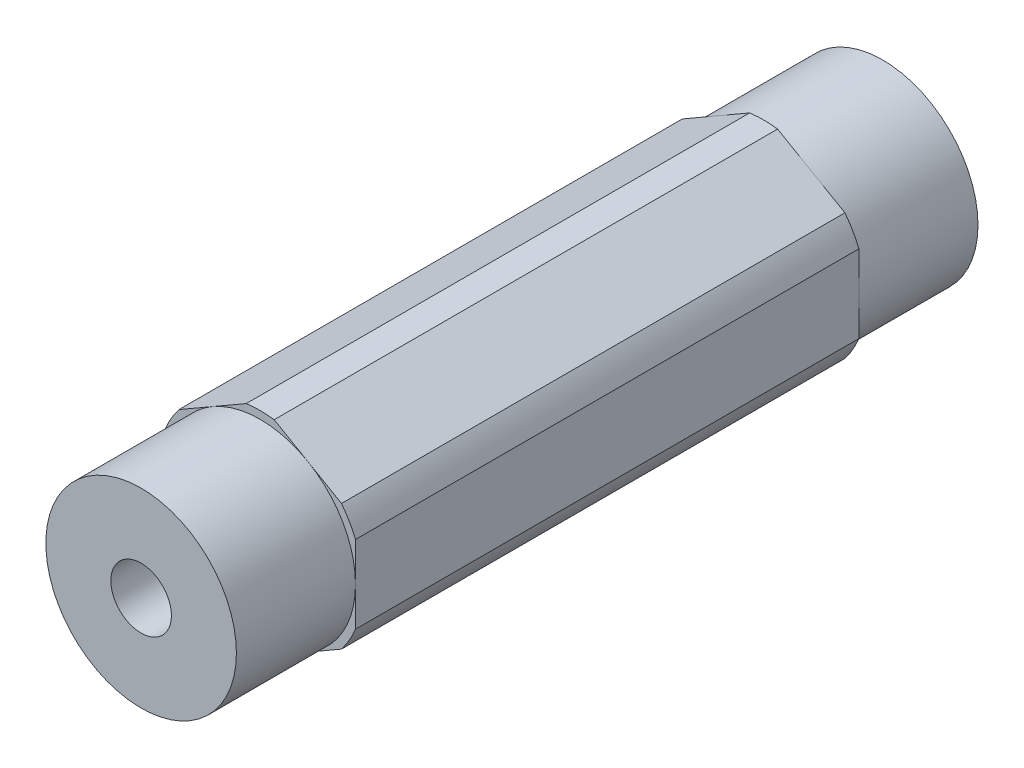
ISO-10303-21;
HEADER;
FILE_DESCRIPTION(('STEP AP214'),'2;1');
FILE_NAME('part.step','',(''),(''),'','','');
FILE_SCHEMA(('AUTOMOTIVE_DESIGN { 1 0 10303 214 1 1 1 1 }'));
ENDSEC;
DATA;
#1=APPLICATION_CONTEXT('core data for automotive mechanical design processes');
#2=APPLICATION_PROTOCOL_DEFINITION('international standard','automotive_design',2000,#1);
#3=PRODUCT_CONTEXT('',#1,'mechanical');
#4=PRODUCT('Part','Part','',(#3));
#5=PRODUCT_RELATED_PRODUCT_CATEGORY('part','',(#4));
#6=PRODUCT_DEFINITION_FORMATION('','',#4);
#7=PRODUCT_DEFINITION_CONTEXT('part definition',#1,'design');
#8=PRODUCT_DEFINITION('design','',#6,#7);
#9=PRODUCT_DEFINITION_SHAPE('','',#8);
#10=(LENGTH_UNIT() NAMED_UNIT(*) SI_UNIT(.MILLI.,.METRE.));
#11=(NAMED_UNIT(*) PLANE_ANGLE_UNIT() SI_UNIT($,.RADIAN.));
#12=(NAMED_UNIT(*) SI_UNIT($,.STERADIAN.) SOLID_ANGLE_UNIT());
#13=UNCERTAINTY_MEASURE_WITH_UNIT(LENGTH_MEASURE(1.E-05),#10,'distance_accuracy_value','');
#14=(GEOMETRIC_REPRESENTATION_CONTEXT(3) GLOBAL_UNCERTAINTY_ASSIGNED_CONTEXT((#13)) GLOBAL_UNIT_ASSIGNED_CONTEXT((#10,
#11,#12)) REPRESENTATION_CONTEXT('',''));
#15=CARTESIAN_POINT('',(0.,0.,0.));
#16=DIRECTION('',(0.,0.,1.));
#17=DIRECTION('',(1.,0.,0.));
#18=AXIS2_PLACEMENT_3D('',#15,#16,#17);
#19=CARTESIAN_POINT('',(0.,0.,-16.77543));
#20=DIRECTION('',(0.,0.,1.));
#21=DIRECTION('',(1.,0.,0.));
#22=AXIS2_PLACEMENT_3D('',#19,#20,#21);
#23=PLANE('',#22);
#24=DIRECTION('',(0.,1.,0.));
#25=VECTOR('',#24,1.);
#26=CARTESIAN_POINT('',(6.35,0.,-16.77543));
#27=LINE('',#26,#25);
#28=CARTESIAN_POINT('',(6.35,0.,-16.77543));
#29=VERTEX_POINT('',#28);
#30=CARTESIAN_POINT('',(6.35,2.59030191290513,-16.77543));
#31=VERTEX_POINT('',#30);
#32=EDGE_CURVE('E226',#29,#31,#27,.T.);
#33=ORIENTED_EDGE('',*,*,#32,.F.);
#34=CARTESIAN_POINT('',(0.,0.,-16.77543));
#35=DIRECTION('',(0.,0.,1.));
#36=DIRECTION('',(1.,0.,0.));
#37=AXIS2_PLACEMENT_3D('',#34,#35,#36);
#38=CIRCLE('',#37,6.35);
#39=CARTESIAN_POINT('',(3.175,5.49926131403119,-16.77543));
#40=VERTEX_POINT('',#39);
#41=EDGE_CURVE('E70',#29,#40,#38,.T.);
#42=ORIENTED_EDGE('',*,*,#41,.T.);
#43=DIRECTION('',(-0.866025403784439,0.5,0.));
#44=VECTOR('',#43,1.);
#45=CARTESIAN_POINT('',(3.175,5.49926131403119,-16.77543));
#46=LINE('',#45,#44);
#47=CARTESIAN_POINT('',(5.41826726004727,4.20411035757862,-16.77543));
#48=VERTEX_POINT('',#47);
#49=EDGE_CURVE('E278',#48,#40,#46,.T.);
#50=ORIENTED_EDGE('',*,*,#49,.F.);
#51=CARTESIAN_POINT('',(0.,0.,-16.77543));
#52=DIRECTION('',(0.,0.,1.));
#53=DIRECTION('',(1.,0.,0.));
#54=AXIS2_PLACEMENT_3D('',#51,#52,#53);
#55=CIRCLE('',#54,6.858);
#56=EDGE_CURVE('E272',#31,#48,#55,.T.);
#57=ORIENTED_EDGE('',*,*,#56,.F.);
#58=EDGE_LOOP('',(#33,#42,#50,#57));
#59=FACE_BOUND('',#58,.T.);
#60=ADVANCED_FACE('F58',(#59),#23,.F.);
#61=CARTESIAN_POINT('',(0.931732739952733,6.79441227048375,-16.77543));
#62=VERTEX_POINT('',#61);
#63=EDGE_CURVE('E275',#40,#62,#46,.T.);
#64=ORIENTED_EDGE('',*,*,#63,.F.);
#65=CARTESIAN_POINT('',(-3.175,5.49926131403119,-16.77543));
#66=VERTEX_POINT('',#65);
#67=EDGE_CURVE('E11',#40,#66,#38,.T.);
#68=ORIENTED_EDGE('',*,*,#67,.T.);
#69=DIRECTION('',(-0.866025403784439,-0.5,0.));
#70=VECTOR('',#69,1.);
#71=CARTESIAN_POINT('',(-3.175,5.49926131403119,-16.77543));
#72=LINE('',#71,#70);
#73=CARTESIAN_POINT('',(-0.931732739952731,6.79441227048375,-16.77543));
#74=VERTEX_POINT('',#73);
#75=EDGE_CURVE('E282',#74,#66,#72,.T.);
#76=ORIENTED_EDGE('',*,*,#75,.F.);
#77=EDGE_CURVE('E277',#62,#74,#55,.T.);
#78=ORIENTED_EDGE('',*,*,#77,.F.);
#79=EDGE_LOOP('',(#64,#68,#76,#78));
#80=FACE_BOUND('',#79,.T.);
#81=ADVANCED_FACE('F444',(#80),#23,.F.);
#82=CARTESIAN_POINT('',(-5.41826726004727,4.20411035757862,-16.77543));
#83=VERTEX_POINT('',#82);
#84=EDGE_CURVE('E287',#66,#83,#72,.T.);
#85=ORIENTED_EDGE('',*,*,#84,.F.);
#86=CARTESIAN_POINT('',(-6.35,0.,-16.77543));
#87=VERTEX_POINT('',#86);
#88=EDGE_CURVE('E68',#66,#87,#38,.T.);
#89=ORIENTED_EDGE('',*,*,#88,.T.);
#90=DIRECTION('',(0.,-1.,0.));
#91=VECTOR('',#90,1.);
#92=CARTESIAN_POINT('',(-6.35,0.,-16.77543));
#93=LINE('',#92,#91);
#94=CARTESIAN_POINT('',(-6.35,2.59030191290514,-16.77543));
#95=VERTEX_POINT('',#94);
#96=EDGE_CURVE('E288',#95,#87,#93,.T.);
#97=ORIENTED_EDGE('',*,*,#96,.F.);
#98=EDGE_CURVE('E286',#83,#95,#55,.T.);
#99=ORIENTED_EDGE('',*,*,#98,.F.);
#100=EDGE_LOOP('',(#85,#89,#97,#99));
#101=FACE_BOUND('',#100,.T.);
#102=ADVANCED_FACE('F391',(#101),#23,.F.);
#103=CARTESIAN_POINT('',(-6.35,-2.59030191290514,-16.77543));
#104=VERTEX_POINT('',#103);
#105=EDGE_CURVE('E293',#87,#104,#93,.T.);
#106=ORIENTED_EDGE('',*,*,#105,.F.);
#107=CARTESIAN_POINT('',(-3.175,-5.49926131403119,-16.77543));
#108=VERTEX_POINT('',#107);
#109=EDGE_CURVE('E377',#87,#108,#38,.T.);
#110=ORIENTED_EDGE('',*,*,#109,.T.);
#111=DIRECTION('',(0.866025403784439,-0.5,0.));
#112=VECTOR('',#111,1.);
#113=CARTESIAN_POINT('',(-3.175,-5.49926131403118,-16.77543));
#114=LINE('',#113,#112);
#115=CARTESIAN_POINT('',(-5.41826726004728,-4.20411035757862,-16.77543));
#116=VERTEX_POINT('',#115);
#117=EDGE_CURVE('E294',#116,#108,#114,.T.);
#118=ORIENTED_EDGE('',*,*,#117,.F.);
#119=EDGE_CURVE('E292',#104,#116,#55,.T.);
#120=ORIENTED_EDGE('',*,*,#119,.F.);
#121=EDGE_LOOP('',(#106,#110,#118,#120));
#122=FACE_BOUND('',#121,.T.);
#123=ADVANCED_FACE('F394',(#122),#23,.F.);
#124=CARTESIAN_POINT('',(-0.931732739952721,-6.79441227048375,-16.77543));
#125=VERTEX_POINT('',#124);
#126=EDGE_CURVE('E299',#108,#125,#114,.T.);
#127=ORIENTED_EDGE('',*,*,#126,.F.);
#128=CARTESIAN_POINT('',(3.175,-5.49926131403119,-16.77543));
#129=VERTEX_POINT('',#128);
#130=EDGE_CURVE('E370',#108,#129,#38,.T.);
#131=ORIENTED_EDGE('',*,*,#130,.T.);
#132=DIRECTION('',(0.866025403784439,0.5,0.));
#133=VECTOR('',#132,1.);
#134=CARTESIAN_POINT('',(3.175,-5.49926131403118,-16.77543));
#135=LINE('',#134,#133);
#136=CARTESIAN_POINT('',(0.931732739952731,-6.79441227048375,-16.77543));
#137=VERTEX_POINT('',#136);
#138=EDGE_CURVE('E300',#137,#129,#135,.T.);
#139=ORIENTED_EDGE('',*,*,#138,.F.);
#140=EDGE_CURVE('E298',#125,#137,#55,.T.);
#141=ORIENTED_EDGE('',*,*,#140,.F.);
#142=EDGE_LOOP('',(#127,#131,#139,#141));
#143=FACE_BOUND('',#142,.T.);
#144=ADVANCED_FACE('F473',(#143),#23,.F.);
#145=CARTESIAN_POINT('',(0.,0.,16.77543));
#146=DIRECTION('',(0.,0.,1.));
#147=DIRECTION('',(1.,0.,0.));
#148=AXIS2_PLACEMENT_3D('',#145,#146,#147);
#149=PLANE('',#148);
#150=CARTESIAN_POINT('',(0.,0.,16.77543));
#151=DIRECTION('',(0.,0.,1.));
#152=DIRECTION('',(1.,0.,0.));
#153=AXIS2_PLACEMENT_3D('',#150,#151,#152);
#154=CIRCLE('',#153,6.35);
#155=CARTESIAN_POINT('',(6.35,0.,16.77543));
#156=VERTEX_POINT('',#155);
#157=CARTESIAN_POINT('',(3.175,5.49926131403119,16.77543));
#158=VERTEX_POINT('',#157);
#159=EDGE_CURVE('E218',#156,#158,#154,.T.);
#160=ORIENTED_EDGE('',*,*,#159,.F.);
#161=DIRECTION('',(0.,1.,0.));
#162=VECTOR('',#161,1.);
#163=CARTESIAN_POINT('',(6.35,0.,16.77543));
#164=LINE('',#163,#162);
#165=CARTESIAN_POINT('',(6.35,2.59030191290513,16.77543));
#166=VERTEX_POINT('',#165);
#167=EDGE_CURVE('E235',#156,#166,#164,.T.);
#168=ORIENTED_EDGE('',*,*,#167,.T.);
#169=CARTESIAN_POINT('',(0.,0.,16.77543));
#170=DIRECTION('',(0.,0.,1.));
#171=DIRECTION('',(1.,0.,0.));
#172=AXIS2_PLACEMENT_3D('',#169,#170,#171);
#173=CIRCLE('',#172,6.858);
#174=CARTESIAN_POINT('',(5.41826726004727,4.20411035757862,16.77543));
#175=VERTEX_POINT('',#174);
#176=EDGE_CURVE('E234',#166,#175,#173,.T.);
#177=ORIENTED_EDGE('',*,*,#176,.T.);
#178=DIRECTION('',(-0.866025403784439,0.5,0.));
#179=VECTOR('',#178,1.);
#180=CARTESIAN_POINT('',(3.175,5.49926131403119,16.77543));
#181=LINE('',#180,#179);
#182=EDGE_CURVE('E241',#175,#158,#181,.T.);
#183=ORIENTED_EDGE('',*,*,#182,.T.);
#184=EDGE_LOOP('',(#160,#168,#177,#183));
#185=FACE_BOUND('',#184,.T.);
#186=ADVANCED_FACE('F425',(#185),#149,.T.);
#187=CARTESIAN_POINT('',(-3.175,5.49926131403119,16.77543));
#188=VERTEX_POINT('',#187);
#189=EDGE_CURVE('E230',#158,#188,#154,.T.);
#190=ORIENTED_EDGE('',*,*,#189,.F.);
#191=CARTESIAN_POINT('',(0.931732739952733,6.79441227048375,16.77543));
#192=VERTEX_POINT('',#191);
#193=EDGE_CURVE('E238',#158,#192,#181,.T.);
#194=ORIENTED_EDGE('',*,*,#193,.T.);
#195=CARTESIAN_POINT('',(-0.931732739952731,6.79441227048375,16.77543));
#196=VERTEX_POINT('',#195);
#197=EDGE_CURVE('E240',#192,#196,#173,.T.);
#198=ORIENTED_EDGE('',*,*,#197,.T.);
#199=DIRECTION('',(-0.866025403784439,-0.5,0.));
#200=VECTOR('',#199,1.);
#201=CARTESIAN_POINT('',(-3.175,5.49926131403119,16.77543));
#202=LINE('',#201,#200);
#203=EDGE_CURVE('E245',#196,#188,#202,.T.);
#204=ORIENTED_EDGE('',*,*,#203,.T.);
#205=EDGE_LOOP('',(#190,#194,#198,#204));
#206=FACE_BOUND('',#205,.T.);
#207=ADVANCED_FACE('F450',(#206),#149,.T.);
#208=CARTESIAN_POINT('',(-6.35,0.,16.77543));
#209=VERTEX_POINT('',#208);
#210=EDGE_CURVE('E364',#188,#209,#154,.T.);
#211=ORIENTED_EDGE('',*,*,#210,.F.);
#212=CARTESIAN_POINT('',(-5.41826726004727,4.20411035757862,16.77543));
#213=VERTEX_POINT('',#212);
#214=EDGE_CURVE('E250',#188,#213,#202,.T.);
#215=ORIENTED_EDGE('',*,*,#214,.T.);
#216=CARTESIAN_POINT('',(-6.35,2.59030191290514,16.77543));
#217=VERTEX_POINT('',#216);
#218=EDGE_CURVE('E249',#213,#217,#173,.T.);
#219=ORIENTED_EDGE('',*,*,#218,.T.);
#220=DIRECTION('',(0.,-1.,0.));
#221=VECTOR('',#220,1.);
#222=CARTESIAN_POINT('',(-6.35,0.,16.77543));
#223=LINE('',#222,#221);
#224=EDGE_CURVE('E251',#217,#209,#223,.T.);
#225=ORIENTED_EDGE('',*,*,#224,.T.);
#226=EDGE_LOOP('',(#211,#215,#219,#225));
#227=FACE_BOUND('',#226,.T.);
#228=ADVANCED_FACE('F480',(#227),#149,.T.);
#229=CARTESIAN_POINT('',(-3.175,-5.49926131403119,16.77543));
#230=VERTEX_POINT('',#229);
#231=EDGE_CURVE('E361',#209,#230,#154,.T.);
#232=ORIENTED_EDGE('',*,*,#231,.F.);
#233=CARTESIAN_POINT('',(-6.35,-2.59030191290514,16.77543));
#234=VERTEX_POINT('',#233);
#235=EDGE_CURVE('E256',#209,#234,#223,.T.);
#236=ORIENTED_EDGE('',*,*,#235,.T.);
#237=CARTESIAN_POINT('',(-5.41826726004728,-4.20411035757862,16.77543));
#238=VERTEX_POINT('',#237);
#239=EDGE_CURVE('E255',#234,#238,#173,.T.);
#240=ORIENTED_EDGE('',*,*,#239,.T.);
#241=DIRECTION('',(0.866025403784439,-0.5,0.));
#242=VECTOR('',#241,1.);
#243=CARTESIAN_POINT('',(-3.175,-5.49926131403118,16.77543));
#244=LINE('',#243,#242);
#245=EDGE_CURVE('E257',#238,#230,#244,.T.);
#246=ORIENTED_EDGE('',*,*,#245,.T.);
#247=EDGE_LOOP('',(#232,#236,#240,#246));
#248=FACE_BOUND('',#247,.T.);
#249=ADVANCED_FACE('F482',(#248),#149,.T.);
#250=CARTESIAN_POINT('',(3.175,-5.49926131403119,16.77543));
#251=VERTEX_POINT('',#250);
#252=EDGE_CURVE('E357',#230,#251,#154,.T.);
#253=ORIENTED_EDGE('',*,*,#252,.F.);
#254=CARTESIAN_POINT('',(-0.931732739952721,-6.79441227048375,16.77543));
#255=VERTEX_POINT('',#254);
#256=EDGE_CURVE('E262',#230,#255,#244,.T.);
#257=ORIENTED_EDGE('',*,*,#256,.T.);
#258=CARTESIAN_POINT('',(0.931732739952731,-6.79441227048375,16.77543));
#259=VERTEX_POINT('',#258);
#260=EDGE_CURVE('E261',#255,#259,#173,.T.);
#261=ORIENTED_EDGE('',*,*,#260,.T.);
#262=DIRECTION('',(0.866025403784439,0.5,0.));
#263=VECTOR('',#262,1.);
#264=CARTESIAN_POINT('',(3.175,-5.49926131403118,16.77543));
#265=LINE('',#264,#263);
#266=EDGE_CURVE('E263',#259,#251,#265,.T.);
#267=ORIENTED_EDGE('',*,*,#266,.T.);
#268=EDGE_LOOP('',(#253,#257,#261,#267));
#269=FACE_BOUND('',#268,.T.);
#270=ADVANCED_FACE('F488',(#269),#149,.T.);
#271=CARTESIAN_POINT('',(6.35,0.,16.77543));
#272=DIRECTION('',(-1.,0.,0.));
#273=DIRECTION('',(0.,-1.,0.));
#274=AXIS2_PLACEMENT_3D('',#271,#272,#273);
#275=PLANE('',#274);
#276=CARTESIAN_POINT('',(6.35,-2.59030191290513,-16.77543));
#277=VERTEX_POINT('',#276);
#278=EDGE_CURVE('E268',#277,#29,#27,.T.);
#279=ORIENTED_EDGE('',*,*,#278,.T.);
#280=ORIENTED_EDGE('',*,*,#32,.T.);
#281=DIRECTION('',(0.,0.,-1.));
#282=VECTOR('',#281,1.);
#283=CARTESIAN_POINT('',(6.35,2.59030191290513,16.77543));
#284=LINE('',#283,#282);
#285=EDGE_CURVE('E62',#166,#31,#284,.T.);
#286=ORIENTED_EDGE('',*,*,#285,.F.);
#287=ORIENTED_EDGE('',*,*,#167,.F.);
#288=CARTESIAN_POINT('',(6.35,-2.59030191290513,16.77543));
#289=VERTEX_POINT('',#288);
#290=EDGE_CURVE('E231',#289,#156,#164,.T.);
#291=ORIENTED_EDGE('',*,*,#290,.F.);
#292=DIRECTION('',(0.,0.,-1.));
#293=VECTOR('',#292,1.);
#294=CARTESIAN_POINT('',(6.35,-2.59030191290513,16.77543));
#295=LINE('',#294,#293);
#296=EDGE_CURVE('E305',#289,#277,#295,.T.);
#297=ORIENTED_EDGE('',*,*,#296,.T.);
#298=EDGE_LOOP('',(#279,#280,#286,#287,#291,#297));
#299=FACE_BOUND('',#298,.T.);
#300=ADVANCED_FACE('F60',(#299),#275,.F.);
#301=CARTESIAN_POINT('',(0.,0.,16.77543));
#302=DIRECTION('',(0.,0.,-1.));
#303=DIRECTION('',(-1.,0.,0.));
#304=AXIS2_PLACEMENT_3D('',#301,#302,#303);
#305=CYLINDRICAL_SURFACE('',#304,6.858);
#306=ORIENTED_EDGE('',*,*,#56,.T.);
#307=DIRECTION('',(0.,0.,-1.));
#308=VECTOR('',#307,1.);
#309=CARTESIAN_POINT('',(5.41826726004727,4.20411035757862,16.77543));
#310=LINE('',#309,#308);
#311=EDGE_CURVE('E344',#175,#48,#310,.T.);
#312=ORIENTED_EDGE('',*,*,#311,.F.);
#313=ORIENTED_EDGE('',*,*,#176,.F.);
#314=ORIENTED_EDGE('',*,*,#285,.T.);
#315=EDGE_LOOP('',(#306,#312,#313,#314));
#316=FACE_BOUND('',#315,.T.);
#317=ADVANCED_FACE('F428',(#316),#305,.T.);
#318=CARTESIAN_POINT('',(3.175,5.49926131403119,16.77543));
#319=DIRECTION('',(-0.5,-0.866025403784439,0.));
#320=DIRECTION('',(0.866025403784439,-0.5,0.));
#321=AXIS2_PLACEMENT_3D('',#318,#319,#320);
#322=PLANE('',#321);
#323=ORIENTED_EDGE('',*,*,#49,.T.);
#324=ORIENTED_EDGE('',*,*,#63,.T.);
#325=DIRECTION('',(0.,0.,-1.));
#326=VECTOR('',#325,1.);
#327=CARTESIAN_POINT('',(0.931732739952733,6.79441227048375,16.77543));
#328=LINE('',#327,#326);
#329=EDGE_CURVE('E341',#192,#62,#328,.T.);
#330=ORIENTED_EDGE('',*,*,#329,.F.);
#331=ORIENTED_EDGE('',*,*,#193,.F.);
#332=ORIENTED_EDGE('',*,*,#182,.F.);
#333=ORIENTED_EDGE('',*,*,#311,.T.);
#334=EDGE_LOOP('',(#323,#324,#330,#331,#332,#333));
#335=FACE_BOUND('',#334,.T.);
#336=ADVANCED_FACE('F433',(#335),#322,.F.);
#337=ORIENTED_EDGE('',*,*,#77,.T.);
#338=DIRECTION('',(0.,0.,-1.));
#339=VECTOR('',#338,1.);
#340=CARTESIAN_POINT('',(-0.931732739952731,6.79441227048375,16.77543));
#341=LINE('',#340,#339);
#342=EDGE_CURVE('E337',#196,#74,#341,.T.);
#343=ORIENTED_EDGE('',*,*,#342,.F.);
#344=ORIENTED_EDGE('',*,*,#197,.F.);
#345=ORIENTED_EDGE('',*,*,#329,.T.);
#346=EDGE_LOOP('',(#337,#343,#344,#345));
#347=FACE_BOUND('',#346,.T.);
#348=ADVANCED_FACE('F441',(#347),#305,.T.);
#349=CARTESIAN_POINT('',(-3.175,5.49926131403119,16.77543));
#350=DIRECTION('',(0.5,-0.866025403784439,0.));
#351=DIRECTION('',(0.866025403784439,0.5,0.));
#352=AXIS2_PLACEMENT_3D('',#349,#350,#351);
#353=PLANE('',#352);
#354=ORIENTED_EDGE('',*,*,#75,.T.);
#355=ORIENTED_EDGE('',*,*,#84,.T.);
#356=DIRECTION('',(0.,0.,-1.));
#357=VECTOR('',#356,1.);
#358=CARTESIAN_POINT('',(-5.41826726004727,4.20411035757862,16.77543));
#359=LINE('',#358,#357);
#360=EDGE_CURVE('E333',#213,#83,#359,.T.);
#361=ORIENTED_EDGE('',*,*,#360,.F.);
#362=ORIENTED_EDGE('',*,*,#214,.F.);
#363=ORIENTED_EDGE('',*,*,#203,.F.);
#364=ORIENTED_EDGE('',*,*,#342,.T.);
#365=EDGE_LOOP('',(#354,#355,#361,#362,#363,#364));
#366=FACE_BOUND('',#365,.T.);
#367=ADVANCED_FACE('F446',(#366),#353,.F.);
#368=ORIENTED_EDGE('',*,*,#98,.T.);
#369=DIRECTION('',(0.,0.,-1.));
#370=VECTOR('',#369,1.);
#371=CARTESIAN_POINT('',(-6.35,2.59030191290514,16.77543));
#372=LINE('',#371,#370);
#373=EDGE_CURVE('E329',#217,#95,#372,.T.);
#374=ORIENTED_EDGE('',*,*,#373,.F.);
#375=ORIENTED_EDGE('',*,*,#218,.F.);
#376=ORIENTED_EDGE('',*,*,#360,.T.);
#377=EDGE_LOOP('',(#368,#374,#375,#376));
#378=FACE_BOUND('',#377,.T.);
#379=ADVANCED_FACE('F404',(#378),#305,.T.);
#380=CARTESIAN_POINT('',(-6.35,0.,16.77543));
#381=DIRECTION('',(1.,0.,0.));
#382=DIRECTION('',(0.,1.,0.));
#383=AXIS2_PLACEMENT_3D('',#380,#381,#382);
#384=PLANE('',#383);
#385=ORIENTED_EDGE('',*,*,#96,.T.);
#386=ORIENTED_EDGE('',*,*,#105,.T.);
#387=DIRECTION('',(0.,0.,-1.));
#388=VECTOR('',#387,1.);
#389=CARTESIAN_POINT('',(-6.35,-2.59030191290514,16.77543));
#390=LINE('',#389,#388);
#391=EDGE_CURVE('E325',#234,#104,#390,.T.);
#392=ORIENTED_EDGE('',*,*,#391,.F.);
#393=ORIENTED_EDGE('',*,*,#235,.F.);
#394=ORIENTED_EDGE('',*,*,#224,.F.);
#395=ORIENTED_EDGE('',*,*,#373,.T.);
#396=EDGE_LOOP('',(#385,#386,#392,#393,#394,#395));
#397=FACE_BOUND('',#396,.T.);
#398=ADVANCED_FACE('F398',(#397),#384,.F.);
#399=ORIENTED_EDGE('',*,*,#119,.T.);
#400=DIRECTION('',(0.,0.,-1.));
#401=VECTOR('',#400,1.);
#402=CARTESIAN_POINT('',(-5.41826726004728,-4.20411035757862,16.77543));
#403=LINE('',#402,#401);
#404=EDGE_CURVE('E321',#238,#116,#403,.T.);
#405=ORIENTED_EDGE('',*,*,#404,.F.);
#406=ORIENTED_EDGE('',*,*,#239,.F.);
#407=ORIENTED_EDGE('',*,*,#391,.T.);
#408=EDGE_LOOP('',(#399,#405,#406,#407));
#409=FACE_BOUND('',#408,.T.);
#410=ADVANCED_FACE('F479',(#409),#305,.T.);
#411=CARTESIAN_POINT('',(-3.175,-5.49926131403118,16.77543));
#412=DIRECTION('',(0.5,0.866025403784439,0.));
#413=DIRECTION('',(-0.866025403784439,0.5,0.));
#414=AXIS2_PLACEMENT_3D('',#411,#412,#413);
#415=PLANE('',#414);
#416=ORIENTED_EDGE('',*,*,#117,.T.);
#417=ORIENTED_EDGE('',*,*,#126,.T.);
#418=DIRECTION('',(0.,0.,-1.));
#419=VECTOR('',#418,1.);
#420=CARTESIAN_POINT('',(-0.931732739952721,-6.79441227048375,16.77543));
#421=LINE('',#420,#419);
#422=EDGE_CURVE('E317',#255,#125,#421,.T.);
#423=ORIENTED_EDGE('',*,*,#422,.F.);
#424=ORIENTED_EDGE('',*,*,#256,.F.);
#425=ORIENTED_EDGE('',*,*,#245,.F.);
#426=ORIENTED_EDGE('',*,*,#404,.T.);
#427=EDGE_LOOP('',(#416,#417,#423,#424,#425,#426));
#428=FACE_BOUND('',#427,.T.);
#429=ADVANCED_FACE('F476',(#428),#415,.F.);
#430=ORIENTED_EDGE('',*,*,#140,.T.);
#431=DIRECTION('',(0.,0.,-1.));
#432=VECTOR('',#431,1.);
#433=CARTESIAN_POINT('',(0.931732739952731,-6.79441227048375,16.77543));
#434=LINE('',#433,#432);
#435=EDGE_CURVE('E313',#259,#137,#434,.T.);
#436=ORIENTED_EDGE('',*,*,#435,.F.);
#437=ORIENTED_EDGE('',*,*,#260,.F.);
#438=ORIENTED_EDGE('',*,*,#422,.T.);
#439=EDGE_LOOP('',(#430,#436,#437,#438));
#440=FACE_BOUND('',#439,.T.);
#441=ADVANCED_FACE('F671',(#440),#305,.T.);
#442=CARTESIAN_POINT('',(3.175,-5.49926131403118,16.77543));
#443=DIRECTION('',(-0.5,0.866025403784439,0.));
#444=DIRECTION('',(-0.866025403784439,-0.5,0.));
#445=AXIS2_PLACEMENT_3D('',#442,#443,#444);
#446=PLANE('',#445);
#447=ORIENTED_EDGE('',*,*,#138,.T.);
#448=CARTESIAN_POINT('',(5.41826726004727,-4.20411035757862,-16.77543));
#449=VERTEX_POINT('',#448);
#450=EDGE_CURVE('E304',#129,#449,#135,.T.);
#451=ORIENTED_EDGE('',*,*,#450,.T.);
#452=DIRECTION('',(0.,0.,-1.));
#453=VECTOR('',#452,1.);
#454=CARTESIAN_POINT('',(5.41826726004727,-4.20411035757862,16.77543));
#455=LINE('',#454,#453);
#456=CARTESIAN_POINT('',(5.41826726004727,-4.20411035757862,16.77543));
#457=VERTEX_POINT('',#456);
#458=EDGE_CURVE('E309',#457,#449,#455,.T.);
#459=ORIENTED_EDGE('',*,*,#458,.F.);
#460=EDGE_CURVE('E267',#251,#457,#265,.T.);
#461=ORIENTED_EDGE('',*,*,#460,.F.);
#462=ORIENTED_EDGE('',*,*,#266,.F.);
#463=ORIENTED_EDGE('',*,*,#435,.T.);
#464=EDGE_LOOP('',(#447,#451,#459,#461,#462,#463));
#465=FACE_BOUND('',#464,.T.);
#466=ADVANCED_FACE('F471',(#465),#446,.F.);
#467=EDGE_CURVE('E276',#449,#277,#55,.T.);
#468=ORIENTED_EDGE('',*,*,#467,.T.);
#469=ORIENTED_EDGE('',*,*,#296,.F.);
#470=EDGE_CURVE('E239',#457,#289,#173,.T.);
#471=ORIENTED_EDGE('',*,*,#470,.F.);
#472=ORIENTED_EDGE('',*,*,#458,.T.);
#473=EDGE_LOOP('',(#468,#469,#471,#472));
#474=FACE_BOUND('',#473,.T.);
#475=ADVANCED_FACE('F468',(#474),#305,.T.);
#476=EDGE_CURVE('E84',#251,#156,#154,.T.);
#477=ORIENTED_EDGE('',*,*,#476,.F.);
#478=ORIENTED_EDGE('',*,*,#460,.T.);
#479=ORIENTED_EDGE('',*,*,#470,.T.);
#480=ORIENTED_EDGE('',*,*,#290,.T.);
#481=EDGE_LOOP('',(#477,#478,#479,#480));
#482=FACE_BOUND('',#481,.T.);
#483=ADVANCED_FACE('F466',(#482),#149,.T.);
#484=ORIENTED_EDGE('',*,*,#450,.F.);
#485=EDGE_CURVE('E221',#129,#29,#38,.T.);
#486=ORIENTED_EDGE('',*,*,#485,.T.);
#487=ORIENTED_EDGE('',*,*,#278,.F.);
#488=ORIENTED_EDGE('',*,*,#467,.F.);
#489=EDGE_LOOP('',(#484,#486,#487,#488));
#490=FACE_BOUND('',#489,.T.);
#491=ADVANCED_FACE('F469',(#490),#23,.F.);
#492=CARTESIAN_POINT('',(0.,0.,24.71293));
#493=DIRECTION('',(0.,0.,-1.));
#494=DIRECTION('',(-1.,0.,0.));
#495=AXIS2_PLACEMENT_3D('',#492,#493,#494);
#496=CYLINDRICAL_SURFACE('',#495,6.35);
#497=CARTESIAN_POINT('',(0.,0.,24.71293));
#498=DIRECTION('',(0.,0.,1.));
#499=DIRECTION('',(1.,0.,0.));
#500=AXIS2_PLACEMENT_3D('',#497,#498,#499);
#501=CIRCLE('',#500,6.35);
#502=CARTESIAN_POINT('',(6.35,0.,24.71293));
#503=VERTEX_POINT('',#502);
#504=EDGE_CURVE('E222',#503,#503,#501,.T.);
#505=ORIENTED_EDGE('',*,*,#504,.F.);
#506=EDGE_LOOP('',(#505));
#507=FACE_BOUND('',#506,.T.);
#508=ORIENTED_EDGE('',*,*,#159,.T.);
#509=ORIENTED_EDGE('',*,*,#189,.T.);
#510=ORIENTED_EDGE('',*,*,#210,.T.);
#511=ORIENTED_EDGE('',*,*,#231,.T.);
#512=ORIENTED_EDGE('',*,*,#252,.T.);
#513=ORIENTED_EDGE('',*,*,#476,.T.);
#514=EDGE_LOOP('',(#508,#509,#510,#511,#512,#513));
#515=FACE_BOUND('',#514,.T.);
#516=ADVANCED_FACE('F498',(#507,#515),#496,.T.);
#517=CARTESIAN_POINT('',(0.,0.,24.71293));
#518=DIRECTION('',(0.,0.,1.));
#519=DIRECTION('',(1.,0.,0.));
#520=AXIS2_PLACEMENT_3D('',#517,#518,#519);
#521=PLANE('',#520);
#522=CARTESIAN_POINT('',(0.,0.,24.71293));
#523=DIRECTION('',(0.,0.,1.));
#524=DIRECTION('',(1.,0.,0.));
#525=AXIS2_PLACEMENT_3D('',#522,#523,#524);
#526=CIRCLE('',#525,2.0193);
#527=CARTESIAN_POINT('',(2.0193,0.,24.71293));
#528=VERTEX_POINT('',#527);
#529=EDGE_CURVE('E202',#528,#528,#526,.T.);
#530=ORIENTED_EDGE('',*,*,#529,.F.);
#531=EDGE_LOOP('',(#530));
#532=FACE_BOUND('',#531,.T.);
#533=ORIENTED_EDGE('',*,*,#504,.T.);
#534=EDGE_LOOP('',(#533));
#535=FACE_BOUND('',#534,.T.);
#536=ADVANCED_FACE('F503',(#532,#535),#521,.T.);
#537=CARTESIAN_POINT('',(0.,0.,-24.71293));
#538=DIRECTION('',(0.,0.,1.));
#539=DIRECTION('',(1.,0.,0.));
#540=AXIS2_PLACEMENT_3D('',#537,#538,#539);
#541=CYLINDRICAL_SURFACE('',#540,6.35);
#542=CARTESIAN_POINT('',(0.,0.,-24.71293));
#543=DIRECTION('',(0.,0.,1.));
#544=DIRECTION('',(1.,0.,0.));
#545=AXIS2_PLACEMENT_3D('',#542,#543,#544);
#546=CIRCLE('',#545,6.35);
#547=CARTESIAN_POINT('',(6.35,0.,-24.71293));
#548=VERTEX_POINT('',#547);
#549=EDGE_CURVE('E215',#548,#548,#546,.T.);
#550=ORIENTED_EDGE('',*,*,#549,.T.);
#551=EDGE_LOOP('',(#550));
#552=FACE_BOUND('',#551,.T.);
#553=ORIENTED_EDGE('',*,*,#41,.F.);
#554=ORIENTED_EDGE('',*,*,#485,.F.);
#555=ORIENTED_EDGE('',*,*,#130,.F.);
#556=ORIENTED_EDGE('',*,*,#109,.F.);
#557=ORIENTED_EDGE('',*,*,#88,.F.);
#558=ORIENTED_EDGE('',*,*,#67,.F.);
#559=EDGE_LOOP('',(#553,#554,#555,#556,#557,#558));
#560=FACE_BOUND('',#559,.T.);
#561=ADVANCED_FACE('F534',(#552,#560),#541,.T.);
#562=CARTESIAN_POINT('',(0.,0.,-24.71293));
#563=DIRECTION('',(0.,0.,-1.));
#564=DIRECTION('',(1.,0.,0.));
#565=AXIS2_PLACEMENT_3D('',#562,#563,#564);
#566=PLANE('',#565);
#567=CARTESIAN_POINT('',(0.,0.,-24.71293));
#568=DIRECTION('',(0.,0.,-1.));
#569=DIRECTION('',(-1.,0.,0.));
#570=AXIS2_PLACEMENT_3D('',#567,#568,#569);
#571=CIRCLE('',#570,2.0193);
#572=CARTESIAN_POINT('',(-2.0193,0.,-24.71293));
#573=VERTEX_POINT('',#572);
#574=EDGE_CURVE('E201',#573,#573,#571,.T.);
#575=ORIENTED_EDGE('',*,*,#574,.F.);
#576=EDGE_LOOP('',(#575));
#577=FACE_BOUND('',#576,.T.);
#578=ORIENTED_EDGE('',*,*,#549,.F.);
#579=EDGE_LOOP('',(#578));
#580=FACE_BOUND('',#579,.T.);
#581=ADVANCED_FACE('F538',(#577,#580),#566,.T.);
#582=CARTESIAN_POINT('',(0.,0.,-12.68349));
#583=DIRECTION('',(0.,0.,-1.));
#584=DIRECTION('',(-1.,0.,0.));
#585=AXIS2_PLACEMENT_3D('',#582,#583,#584);
#586=CONICAL_SURFACE('',#585,2.0193,1.02974425867665);
#587=CARTESIAN_POINT('',(0.,0.,-11.4701721519976));
#588=VERTEX_POINT('',#587);
#589=VERTEX_LOOP('',#588);
#590=FACE_BOUND('',#589,.T.);
#591=CARTESIAN_POINT('',(0.,0.,-12.68349));
#592=DIRECTION('',(0.,0.,-1.));
#593=DIRECTION('',(-1.,0.,0.));
#594=AXIS2_PLACEMENT_3D('',#591,#592,#593);
#595=CIRCLE('',#594,2.0193);
#596=CARTESIAN_POINT('',(-2.0193,0.,-12.68349));
#597=VERTEX_POINT('',#596);
#598=EDGE_CURVE('E207',#597,#597,#595,.T.);
#599=ORIENTED_EDGE('',*,*,#598,.T.);
#600=EDGE_LOOP('',(#599));
#601=FACE_BOUND('',#600,.T.);
#602=ADVANCED_FACE('F550',(#590,#601),#586,.F.);
#603=CARTESIAN_POINT('',(0.,0.,-24.71293));
#604=DIRECTION('',(0.,0.,-1.));
#605=DIRECTION('',(-1.,0.,0.));
#606=AXIS2_PLACEMENT_3D('',#603,#604,#605);
#607=CYLINDRICAL_SURFACE('',#606,2.0193);
#608=ORIENTED_EDGE('',*,*,#598,.F.);
#609=EDGE_LOOP('',(#608));
#610=FACE_BOUND('',#609,.T.);
#611=ORIENTED_EDGE('',*,*,#574,.T.);
#612=EDGE_LOOP('',(#611));
#613=FACE_BOUND('',#612,.T.);
#614=ADVANCED_FACE('F194',(#610,#613),#607,.F.);
#615=CARTESIAN_POINT('',(0.,0.,12.68349));
#616=DIRECTION('',(0.,0.,1.));
#617=DIRECTION('',(1.,0.,0.));
#618=AXIS2_PLACEMENT_3D('',#615,#616,#617);
#619=CONICAL_SURFACE('',#618,2.0193,1.02974425867665);
#620=CARTESIAN_POINT('',(0.,0.,11.4701721519976));
#621=VERTEX_POINT('',#620);
#622=VERTEX_LOOP('',#621);
#623=FACE_BOUND('',#622,.T.);
#624=CARTESIAN_POINT('',(0.,0.,12.68349));
#625=DIRECTION('',(0.,0.,1.));
#626=DIRECTION('',(1.,0.,0.));
#627=AXIS2_PLACEMENT_3D('',#624,#625,#626);
#628=CIRCLE('',#627,2.0193);
#629=CARTESIAN_POINT('',(2.0193,0.,12.68349));
#630=VERTEX_POINT('',#629);
#631=EDGE_CURVE('E198',#630,#630,#628,.T.);
#632=ORIENTED_EDGE('',*,*,#631,.T.);
#633=EDGE_LOOP('',(#632));
#634=FACE_BOUND('',#633,.T.);
#635=ADVANCED_FACE('F190',(#623,#634),#619,.F.);
#636=CARTESIAN_POINT('',(0.,0.,24.71293));
#637=DIRECTION('',(0.,0.,1.));
#638=DIRECTION('',(1.,0.,0.));
#639=AXIS2_PLACEMENT_3D('',#636,#637,#638);
#640=CYLINDRICAL_SURFACE('',#639,2.0193);
#641=ORIENTED_EDGE('',*,*,#631,.F.);
#642=EDGE_LOOP('',(#641));
#643=FACE_BOUND('',#642,.T.);
#644=ORIENTED_EDGE('',*,*,#529,.T.);
#645=EDGE_LOOP('',(#644));
#646=FACE_BOUND('',#645,.T.);
#647=ADVANCED_FACE('F193',(#643,#646),#640,.F.);
#648=CLOSED_SHELL('',(#60,#81,#102,#123,#144,#186,#207,#228,#249,#270,#300,#317,#336,#348,#367,
#379,#398,#410,#429,#441,#466,#475,#483,#491,#516,#536,#561,#581,#602,#614,#635,#647));
#649=MANIFOLD_SOLID_BREP('B2',#648);
#650=ADVANCED_BREP_SHAPE_REPRESENTATION('',(#18,#649),#14);
#651=SHAPE_DEFINITION_REPRESENTATION(#9,#650);
ENDSEC;
END-ISO-10303-21;
